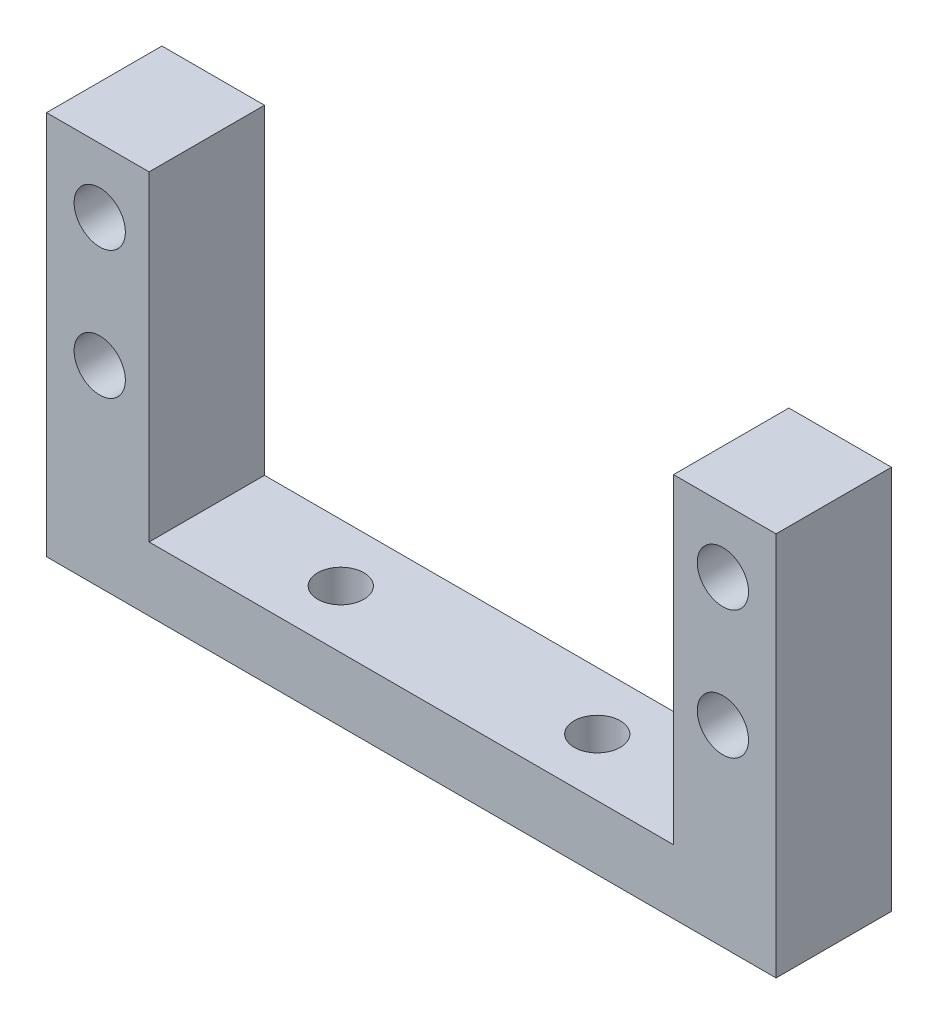
ISO-10303-21;
HEADER;
FILE_DESCRIPTION(('STEP AP214'),'2;1');
FILE_NAME('part.step','',(''),(''),'','','');
FILE_SCHEMA(('AUTOMOTIVE_DESIGN { 1 0 10303 214 1 1 1 1 }'));
ENDSEC;
DATA;
#1=APPLICATION_CONTEXT('core data for automotive mechanical design processes');
#2=APPLICATION_PROTOCOL_DEFINITION('international standard','automotive_design',2000,#1);
#3=PRODUCT_CONTEXT('',#1,'mechanical');
#4=PRODUCT('Part','Part','',(#3));
#5=PRODUCT_RELATED_PRODUCT_CATEGORY('part','',(#4));
#6=PRODUCT_DEFINITION_FORMATION('','',#4);
#7=PRODUCT_DEFINITION_CONTEXT('part definition',#1,'design');
#8=PRODUCT_DEFINITION('design','',#6,#7);
#9=PRODUCT_DEFINITION_SHAPE('','',#8);
#10=(LENGTH_UNIT() NAMED_UNIT(*) SI_UNIT(.MILLI.,.METRE.));
#11=(NAMED_UNIT(*) PLANE_ANGLE_UNIT() SI_UNIT($,.RADIAN.));
#12=(NAMED_UNIT(*) SI_UNIT($,.STERADIAN.) SOLID_ANGLE_UNIT());
#13=UNCERTAINTY_MEASURE_WITH_UNIT(LENGTH_MEASURE(1.E-05),#10,'distance_accuracy_value','');
#14=(GEOMETRIC_REPRESENTATION_CONTEXT(3) GLOBAL_UNCERTAINTY_ASSIGNED_CONTEXT((#13)) GLOBAL_UNIT_ASSIGNED_CONTEXT((#10,
#11,#12)) REPRESENTATION_CONTEXT('',''));
#15=CARTESIAN_POINT('',(0.,0.,0.));
#16=DIRECTION('',(0.,0.,1.));
#17=DIRECTION('',(1.,0.,0.));
#18=AXIS2_PLACEMENT_3D('',#15,#16,#17);
#19=CARTESIAN_POINT('',(0.,0.,9.));
#20=DIRECTION('',(0.,1.,0.));
#21=DIRECTION('',(-1.,0.,0.));
#22=AXIS2_PLACEMENT_3D('',#19,#20,#21);
#23=PLANE('',#22);
#24=CARTESIAN_POINT('',(18.45,0.,4.5));
#25=DIRECTION('',(0.,-1.,0.));
#26=DIRECTION('',(1.,0.,0.));
#27=AXIS2_PLACEMENT_3D('',#24,#25,#26);
#28=CIRCLE('',#27,1.8);
#29=CARTESIAN_POINT('',(20.25,0.,4.5));
#30=VERTEX_POINT('',#29);
#31=EDGE_CURVE('E197',#30,#30,#28,.T.);
#32=ORIENTED_EDGE('',*,*,#31,.F.);
#33=EDGE_LOOP('',(#32));
#34=FACE_BOUND('',#33,.T.);
#35=CARTESIAN_POINT('',(38.45,0.,4.5));
#36=DIRECTION('',(0.,-1.,0.));
#37=DIRECTION('',(1.,0.,0.));
#38=AXIS2_PLACEMENT_3D('',#35,#36,#37);
#39=CIRCLE('',#38,1.8);
#40=CARTESIAN_POINT('',(40.25,0.,4.5));
#41=VERTEX_POINT('',#40);
#42=EDGE_CURVE('E202',#41,#41,#39,.T.);
#43=ORIENTED_EDGE('',*,*,#42,.F.);
#44=EDGE_LOOP('',(#43));
#45=FACE_BOUND('',#44,.T.);
#46=DIRECTION('',(1.,0.,0.));
#47=VECTOR('',#46,1.);
#48=CARTESIAN_POINT('',(0.,0.,0.));
#49=LINE('',#48,#47);
#50=CARTESIAN_POINT('',(0.,0.,0.));
#51=VERTEX_POINT('',#50);
#52=CARTESIAN_POINT('',(56.9,0.,0.));
#53=VERTEX_POINT('',#52);
#54=EDGE_CURVE('E155',#51,#53,#49,.T.);
#55=ORIENTED_EDGE('',*,*,#54,.T.);
#56=DIRECTION('',(0.,0.,-1.));
#57=VECTOR('',#56,1.);
#58=CARTESIAN_POINT('',(56.9,0.,9.));
#59=LINE('',#58,#57);
#60=CARTESIAN_POINT('',(56.9,0.,9.));
#61=VERTEX_POINT('',#60);
#62=EDGE_CURVE('E11',#61,#53,#59,.T.);
#63=ORIENTED_EDGE('',*,*,#62,.F.);
#64=DIRECTION('',(1.,0.,0.));
#65=VECTOR('',#64,1.);
#66=CARTESIAN_POINT('',(0.,0.,9.));
#67=LINE('',#66,#65);
#68=CARTESIAN_POINT('',(0.,0.,9.));
#69=VERTEX_POINT('',#68);
#70=EDGE_CURVE('E187',#69,#61,#67,.T.);
#71=ORIENTED_EDGE('',*,*,#70,.F.);
#72=DIRECTION('',(0.,0.,-1.));
#73=VECTOR('',#72,1.);
#74=CARTESIAN_POINT('',(0.,0.,9.));
#75=LINE('',#74,#73);
#76=EDGE_CURVE('E61',#69,#51,#75,.T.);
#77=ORIENTED_EDGE('',*,*,#76,.T.);
#78=EDGE_LOOP('',(#55,#63,#71,#77));
#79=FACE_BOUND('',#78,.T.);
#80=ADVANCED_FACE('F43',(#34,#45,#79),#23,.F.);
#81=CARTESIAN_POINT('',(56.9,0.,9.));
#82=DIRECTION('',(-1.,0.,0.));
#83=DIRECTION('',(0.,-1.,0.));
#84=AXIS2_PLACEMENT_3D('',#81,#82,#83);
#85=PLANE('',#84);
#86=DIRECTION('',(0.,1.,0.));
#87=VECTOR('',#86,1.);
#88=CARTESIAN_POINT('',(56.9,0.,0.));
#89=LINE('',#88,#87);
#90=CARTESIAN_POINT('',(56.9,30.,0.));
#91=VERTEX_POINT('',#90);
#92=EDGE_CURVE('E157',#53,#91,#89,.T.);
#93=ORIENTED_EDGE('',*,*,#92,.T.);
#94=DIRECTION('',(0.,0.,-1.));
#95=VECTOR('',#94,1.);
#96=CARTESIAN_POINT('',(56.9,30.,9.));
#97=LINE('',#96,#95);
#98=CARTESIAN_POINT('',(56.9,30.,9.));
#99=VERTEX_POINT('',#98);
#100=EDGE_CURVE('E52',#99,#91,#97,.T.);
#101=ORIENTED_EDGE('',*,*,#100,.F.);
#102=DIRECTION('',(0.,1.,0.));
#103=VECTOR('',#102,1.);
#104=CARTESIAN_POINT('',(56.9,0.,9.));
#105=LINE('',#104,#103);
#106=EDGE_CURVE('E99',#61,#99,#105,.T.);
#107=ORIENTED_EDGE('',*,*,#106,.F.);
#108=ORIENTED_EDGE('',*,*,#62,.T.);
#109=EDGE_LOOP('',(#93,#101,#107,#108));
#110=FACE_BOUND('',#109,.T.);
#111=ADVANCED_FACE('F239',(#110),#85,.F.);
#112=CARTESIAN_POINT('',(0.,30.,9.));
#113=DIRECTION('',(0.,1.,0.));
#114=DIRECTION('',(-1.,0.,0.));
#115=AXIS2_PLACEMENT_3D('',#112,#113,#114);
#116=PLANE('',#115);
#117=DIRECTION('',(1.,0.,0.));
#118=VECTOR('',#117,1.);
#119=CARTESIAN_POINT('',(0.,30.,0.));
#120=LINE('',#119,#118);
#121=CARTESIAN_POINT('',(48.9,30.,0.));
#122=VERTEX_POINT('',#121);
#123=EDGE_CURVE('E160',#122,#91,#120,.T.);
#124=ORIENTED_EDGE('',*,*,#123,.F.);
#125=DIRECTION('',(0.,0.,-1.));
#126=VECTOR('',#125,1.);
#127=CARTESIAN_POINT('',(48.9,30.,9.));
#128=LINE('',#127,#126);
#129=CARTESIAN_POINT('',(48.9,30.,9.));
#130=VERTEX_POINT('',#129);
#131=EDGE_CURVE('E193',#130,#122,#128,.T.);
#132=ORIENTED_EDGE('',*,*,#131,.F.);
#133=DIRECTION('',(1.,0.,0.));
#134=VECTOR('',#133,1.);
#135=CARTESIAN_POINT('',(0.,30.,9.));
#136=LINE('',#135,#134);
#137=EDGE_CURVE('E211',#130,#99,#136,.T.);
#138=ORIENTED_EDGE('',*,*,#137,.T.);
#139=ORIENTED_EDGE('',*,*,#100,.T.);
#140=EDGE_LOOP('',(#124,#132,#138,#139));
#141=FACE_BOUND('',#140,.T.);
#142=ADVANCED_FACE('F244',(#141),#116,.T.);
#143=CARTESIAN_POINT('',(48.9,0.,9.));
#144=DIRECTION('',(-1.,0.,0.));
#145=DIRECTION('',(0.,-1.,0.));
#146=AXIS2_PLACEMENT_3D('',#143,#144,#145);
#147=PLANE('',#146);
#148=DIRECTION('',(0.,1.,0.));
#149=VECTOR('',#148,1.);
#150=CARTESIAN_POINT('',(48.9,0.,0.));
#151=LINE('',#150,#149);
#152=CARTESIAN_POINT('',(48.9,5.,0.));
#153=VERTEX_POINT('',#152);
#154=EDGE_CURVE('E163',#153,#122,#151,.T.);
#155=ORIENTED_EDGE('',*,*,#154,.F.);
#156=DIRECTION('',(0.,0.,-1.));
#157=VECTOR('',#156,1.);
#158=CARTESIAN_POINT('',(48.9,5.,9.));
#159=LINE('',#158,#157);
#160=CARTESIAN_POINT('',(48.9,5.,9.));
#161=VERTEX_POINT('',#160);
#162=EDGE_CURVE('E191',#161,#153,#159,.T.);
#163=ORIENTED_EDGE('',*,*,#162,.F.);
#164=DIRECTION('',(0.,1.,0.));
#165=VECTOR('',#164,1.);
#166=CARTESIAN_POINT('',(48.9,0.,9.));
#167=LINE('',#166,#165);
#168=EDGE_CURVE('E214',#161,#130,#167,.T.);
#169=ORIENTED_EDGE('',*,*,#168,.T.);
#170=ORIENTED_EDGE('',*,*,#131,.T.);
#171=EDGE_LOOP('',(#155,#163,#169,#170));
#172=FACE_BOUND('',#171,.T.);
#173=ADVANCED_FACE('F252',(#172),#147,.T.);
#174=CARTESIAN_POINT('',(0.,5.,9.));
#175=DIRECTION('',(0.,1.,0.));
#176=DIRECTION('',(0.,0.,1.));
#177=AXIS2_PLACEMENT_3D('',#174,#175,#176);
#178=PLANE('',#177);
#179=CARTESIAN_POINT('',(18.45,5.,4.5));
#180=DIRECTION('',(0.,1.,0.));
#181=DIRECTION('',(0.,0.,1.));
#182=AXIS2_PLACEMENT_3D('',#179,#180,#181);
#183=CIRCLE('',#182,1.8);
#184=CARTESIAN_POINT('',(18.45,5.,6.3));
#185=VERTEX_POINT('',#184);
#186=EDGE_CURVE('E46',#185,#185,#183,.T.);
#187=ORIENTED_EDGE('',*,*,#186,.F.);
#188=EDGE_LOOP('',(#187));
#189=FACE_BOUND('',#188,.T.);
#190=CARTESIAN_POINT('',(38.45,5.,4.5));
#191=DIRECTION('',(0.,1.,0.));
#192=DIRECTION('',(0.,0.,1.));
#193=AXIS2_PLACEMENT_3D('',#190,#191,#192);
#194=CIRCLE('',#193,1.8);
#195=CARTESIAN_POINT('',(38.45,5.,6.3));
#196=VERTEX_POINT('',#195);
#197=EDGE_CURVE('E195',#196,#196,#194,.T.);
#198=ORIENTED_EDGE('',*,*,#197,.F.);
#199=EDGE_LOOP('',(#198));
#200=FACE_BOUND('',#199,.T.);
#201=DIRECTION('',(1.,0.,0.));
#202=VECTOR('',#201,1.);
#203=CARTESIAN_POINT('',(0.,5.,0.));
#204=LINE('',#203,#202);
#205=CARTESIAN_POINT('',(8.,5.,0.));
#206=VERTEX_POINT('',#205);
#207=EDGE_CURVE('E166',#206,#153,#204,.T.);
#208=ORIENTED_EDGE('',*,*,#207,.F.);
#209=DIRECTION('',(0.,0.,-1.));
#210=VECTOR('',#209,1.);
#211=CARTESIAN_POINT('',(8.,5.,9.));
#212=LINE('',#211,#210);
#213=CARTESIAN_POINT('',(8.,5.,9.));
#214=VERTEX_POINT('',#213);
#215=EDGE_CURVE('E135',#214,#206,#212,.T.);
#216=ORIENTED_EDGE('',*,*,#215,.F.);
#217=DIRECTION('',(1.,0.,0.));
#218=VECTOR('',#217,1.);
#219=CARTESIAN_POINT('',(0.,5.,9.));
#220=LINE('',#219,#218);
#221=EDGE_CURVE('E125',#214,#161,#220,.T.);
#222=ORIENTED_EDGE('',*,*,#221,.T.);
#223=ORIENTED_EDGE('',*,*,#162,.T.);
#224=EDGE_LOOP('',(#208,#216,#222,#223));
#225=FACE_BOUND('',#224,.T.);
#226=ADVANCED_FACE('F218',(#189,#200,#225),#178,.T.);
#227=CARTESIAN_POINT('',(8.,0.,9.));
#228=DIRECTION('',(-1.,0.,0.));
#229=DIRECTION('',(0.,0.,1.));
#230=AXIS2_PLACEMENT_3D('',#227,#228,#229);
#231=PLANE('',#230);
#232=DIRECTION('',(0.,1.,0.));
#233=VECTOR('',#232,1.);
#234=CARTESIAN_POINT('',(8.,0.,0.));
#235=LINE('',#234,#233);
#236=CARTESIAN_POINT('',(8.,30.,0.));
#237=VERTEX_POINT('',#236);
#238=EDGE_CURVE('E132',#206,#237,#235,.T.);
#239=ORIENTED_EDGE('',*,*,#238,.T.);
#240=DIRECTION('',(0.,0.,-1.));
#241=VECTOR('',#240,1.);
#242=CARTESIAN_POINT('',(8.,30.,9.));
#243=LINE('',#242,#241);
#244=CARTESIAN_POINT('',(8.,30.,9.));
#245=VERTEX_POINT('',#244);
#246=EDGE_CURVE('E129',#245,#237,#243,.T.);
#247=ORIENTED_EDGE('',*,*,#246,.F.);
#248=DIRECTION('',(0.,1.,0.));
#249=VECTOR('',#248,1.);
#250=CARTESIAN_POINT('',(8.,0.,9.));
#251=LINE('',#250,#249);
#252=EDGE_CURVE('E116',#214,#245,#251,.T.);
#253=ORIENTED_EDGE('',*,*,#252,.F.);
#254=ORIENTED_EDGE('',*,*,#215,.T.);
#255=EDGE_LOOP('',(#239,#247,#253,#254));
#256=FACE_BOUND('',#255,.T.);
#257=ADVANCED_FACE('F130',(#256),#231,.F.);
#258=CARTESIAN_POINT('',(0.,30.,9.));
#259=DIRECTION('',(0.,1.,0.));
#260=DIRECTION('',(0.,0.,1.));
#261=AXIS2_PLACEMENT_3D('',#258,#259,#260);
#262=PLANE('',#261);
#263=DIRECTION('',(1.,0.,0.));
#264=VECTOR('',#263,1.);
#265=CARTESIAN_POINT('',(0.,30.,0.));
#266=LINE('',#265,#264);
#267=CARTESIAN_POINT('',(0.,30.,0.));
#268=VERTEX_POINT('',#267);
#269=EDGE_CURVE('E170',#268,#237,#266,.T.);
#270=ORIENTED_EDGE('',*,*,#269,.F.);
#271=DIRECTION('',(0.,0.,-1.));
#272=VECTOR('',#271,1.);
#273=CARTESIAN_POINT('',(0.,30.,9.));
#274=LINE('',#273,#272);
#275=CARTESIAN_POINT('',(0.,30.,9.));
#276=VERTEX_POINT('',#275);
#277=EDGE_CURVE('E87',#276,#268,#274,.T.);
#278=ORIENTED_EDGE('',*,*,#277,.F.);
#279=DIRECTION('',(1.,0.,0.));
#280=VECTOR('',#279,1.);
#281=CARTESIAN_POINT('',(0.,30.,9.));
#282=LINE('',#281,#280);
#283=EDGE_CURVE('E122',#276,#245,#282,.T.);
#284=ORIENTED_EDGE('',*,*,#283,.T.);
#285=ORIENTED_EDGE('',*,*,#246,.T.);
#286=EDGE_LOOP('',(#270,#278,#284,#285));
#287=FACE_BOUND('',#286,.T.);
#288=ADVANCED_FACE('F137',(#287),#262,.T.);
#289=CARTESIAN_POINT('',(52.75,15.,9.));
#290=DIRECTION('',(0.,0.,-1.));
#291=DIRECTION('',(-1.,0.,0.));
#292=AXIS2_PLACEMENT_3D('',#289,#290,#291);
#293=CYLINDRICAL_SURFACE('',#292,2.);
#294=CARTESIAN_POINT('',(52.75,15.,9.));
#295=DIRECTION('',(0.,0.,1.));
#296=DIRECTION('',(1.,0.,0.));
#297=AXIS2_PLACEMENT_3D('',#294,#295,#296);
#298=CIRCLE('',#297,2.);
#299=CARTESIAN_POINT('',(54.75,15.,9.));
#300=VERTEX_POINT('',#299);
#301=EDGE_CURVE('E149',#300,#300,#298,.T.);
#302=ORIENTED_EDGE('',*,*,#301,.T.);
#303=EDGE_LOOP('',(#302));
#304=FACE_BOUND('',#303,.T.);
#305=CARTESIAN_POINT('',(52.75,15.,0.));
#306=DIRECTION('',(0.,0.,1.));
#307=DIRECTION('',(1.,0.,0.));
#308=AXIS2_PLACEMENT_3D('',#305,#306,#307);
#309=CIRCLE('',#308,2.);
#310=CARTESIAN_POINT('',(54.75,15.,0.));
#311=VERTEX_POINT('',#310);
#312=EDGE_CURVE('E181',#311,#311,#309,.T.);
#313=ORIENTED_EDGE('',*,*,#312,.F.);
#314=EDGE_LOOP('',(#313));
#315=FACE_BOUND('',#314,.T.);
#316=ADVANCED_FACE('F265',(#304,#315),#293,.F.);
#317=CARTESIAN_POINT('',(4.15,25.,9.));
#318=DIRECTION('',(0.,0.,-1.));
#319=DIRECTION('',(-1.,0.,0.));
#320=AXIS2_PLACEMENT_3D('',#317,#318,#319);
#321=CYLINDRICAL_SURFACE('',#320,2.);
#322=CARTESIAN_POINT('',(4.15,25.,9.));
#323=DIRECTION('',(0.,0.,1.));
#324=DIRECTION('',(1.,0.,0.));
#325=AXIS2_PLACEMENT_3D('',#322,#323,#324);
#326=CIRCLE('',#325,2.);
#327=CARTESIAN_POINT('',(6.15,25.,9.));
#328=VERTEX_POINT('',#327);
#329=EDGE_CURVE('E146',#328,#328,#326,.T.);
#330=ORIENTED_EDGE('',*,*,#329,.T.);
#331=EDGE_LOOP('',(#330));
#332=FACE_BOUND('',#331,.T.);
#333=CARTESIAN_POINT('',(4.15,25.,0.));
#334=DIRECTION('',(0.,0.,1.));
#335=DIRECTION('',(1.,0.,0.));
#336=AXIS2_PLACEMENT_3D('',#333,#334,#335);
#337=CIRCLE('',#336,2.);
#338=CARTESIAN_POINT('',(6.15,25.,0.));
#339=VERTEX_POINT('',#338);
#340=EDGE_CURVE('E178',#339,#339,#337,.T.);
#341=ORIENTED_EDGE('',*,*,#340,.F.);
#342=EDGE_LOOP('',(#341));
#343=FACE_BOUND('',#342,.T.);
#344=ADVANCED_FACE('F234',(#332,#343),#321,.F.);
#345=CARTESIAN_POINT('',(4.15,15.,9.));
#346=DIRECTION('',(0.,0.,-1.));
#347=DIRECTION('',(-1.,0.,0.));
#348=AXIS2_PLACEMENT_3D('',#345,#346,#347);
#349=CYLINDRICAL_SURFACE('',#348,2.);
#350=CARTESIAN_POINT('',(4.15,15.,9.));
#351=DIRECTION('',(0.,0.,1.));
#352=DIRECTION('',(1.,0.,0.));
#353=AXIS2_PLACEMENT_3D('',#350,#351,#352);
#354=CIRCLE('',#353,2.);
#355=CARTESIAN_POINT('',(6.15,15.,9.));
#356=VERTEX_POINT('',#355);
#357=EDGE_CURVE('E140',#356,#356,#354,.T.);
#358=ORIENTED_EDGE('',*,*,#357,.T.);
#359=EDGE_LOOP('',(#358));
#360=FACE_BOUND('',#359,.T.);
#361=CARTESIAN_POINT('',(4.15,15.,0.));
#362=DIRECTION('',(0.,0.,1.));
#363=DIRECTION('',(1.,0.,0.));
#364=AXIS2_PLACEMENT_3D('',#361,#362,#363);
#365=CIRCLE('',#364,2.);
#366=CARTESIAN_POINT('',(6.15,15.,0.));
#367=VERTEX_POINT('',#366);
#368=EDGE_CURVE('E175',#367,#367,#365,.T.);
#369=ORIENTED_EDGE('',*,*,#368,.F.);
#370=EDGE_LOOP('',(#369));
#371=FACE_BOUND('',#370,.T.);
#372=ADVANCED_FACE('F226',(#360,#371),#349,.F.);
#373=CARTESIAN_POINT('',(0.,0.,9.));
#374=DIRECTION('',(-1.,0.,0.));
#375=DIRECTION('',(0.,0.,1.));
#376=AXIS2_PLACEMENT_3D('',#373,#374,#375);
#377=PLANE('',#376);
#378=DIRECTION('',(0.,1.,0.));
#379=VECTOR('',#378,1.);
#380=CARTESIAN_POINT('',(0.,0.,0.));
#381=LINE('',#380,#379);
#382=EDGE_CURVE('E172',#51,#268,#381,.T.);
#383=ORIENTED_EDGE('',*,*,#382,.F.);
#384=ORIENTED_EDGE('',*,*,#76,.F.);
#385=DIRECTION('',(0.,1.,0.));
#386=VECTOR('',#385,1.);
#387=CARTESIAN_POINT('',(0.,0.,9.));
#388=LINE('',#387,#386);
#389=EDGE_CURVE('E138',#69,#276,#388,.T.);
#390=ORIENTED_EDGE('',*,*,#389,.T.);
#391=ORIENTED_EDGE('',*,*,#277,.T.);
#392=EDGE_LOOP('',(#383,#384,#390,#391));
#393=FACE_BOUND('',#392,.T.);
#394=ADVANCED_FACE('F223',(#393),#377,.T.);
#395=CARTESIAN_POINT('',(52.75,25.,9.));
#396=DIRECTION('',(0.,0.,-1.));
#397=DIRECTION('',(-1.,0.,0.));
#398=AXIS2_PLACEMENT_3D('',#395,#396,#397);
#399=CYLINDRICAL_SURFACE('',#398,2.);
#400=CARTESIAN_POINT('',(52.75,25.,9.));
#401=DIRECTION('',(0.,0.,1.));
#402=DIRECTION('',(1.,0.,0.));
#403=AXIS2_PLACEMENT_3D('',#400,#401,#402);
#404=CIRCLE('',#403,2.);
#405=CARTESIAN_POINT('',(54.75,25.,9.));
#406=VERTEX_POINT('',#405);
#407=EDGE_CURVE('E152',#406,#406,#404,.T.);
#408=ORIENTED_EDGE('',*,*,#407,.T.);
#409=EDGE_LOOP('',(#408));
#410=FACE_BOUND('',#409,.T.);
#411=CARTESIAN_POINT('',(52.75,25.,0.));
#412=DIRECTION('',(0.,0.,1.));
#413=DIRECTION('',(1.,0.,0.));
#414=AXIS2_PLACEMENT_3D('',#411,#412,#413);
#415=CIRCLE('',#414,2.);
#416=CARTESIAN_POINT('',(54.75,25.,0.));
#417=VERTEX_POINT('',#416);
#418=EDGE_CURVE('E184',#417,#417,#415,.T.);
#419=ORIENTED_EDGE('',*,*,#418,.F.);
#420=EDGE_LOOP('',(#419));
#421=FACE_BOUND('',#420,.T.);
#422=ADVANCED_FACE('F225',(#410,#421),#399,.F.);
#423=CARTESIAN_POINT('',(0.,0.,9.));
#424=DIRECTION('',(0.,0.,1.));
#425=DIRECTION('',(1.,0.,0.));
#426=AXIS2_PLACEMENT_3D('',#423,#424,#425);
#427=PLANE('',#426);
#428=ORIENTED_EDGE('',*,*,#70,.T.);
#429=ORIENTED_EDGE('',*,*,#106,.T.);
#430=ORIENTED_EDGE('',*,*,#137,.F.);
#431=ORIENTED_EDGE('',*,*,#168,.F.);
#432=ORIENTED_EDGE('',*,*,#221,.F.);
#433=ORIENTED_EDGE('',*,*,#252,.T.);
#434=ORIENTED_EDGE('',*,*,#283,.F.);
#435=ORIENTED_EDGE('',*,*,#389,.F.);
#436=EDGE_LOOP('',(#428,#429,#430,#431,#432,#433,#434,#435));
#437=FACE_BOUND('',#436,.T.);
#438=ORIENTED_EDGE('',*,*,#357,.F.);
#439=EDGE_LOOP('',(#438));
#440=FACE_BOUND('',#439,.T.);
#441=ORIENTED_EDGE('',*,*,#329,.F.);
#442=EDGE_LOOP('',(#441));
#443=FACE_BOUND('',#442,.T.);
#444=ORIENTED_EDGE('',*,*,#301,.F.);
#445=EDGE_LOOP('',(#444));
#446=FACE_BOUND('',#445,.T.);
#447=ORIENTED_EDGE('',*,*,#407,.F.);
#448=EDGE_LOOP('',(#447));
#449=FACE_BOUND('',#448,.T.);
#450=ADVANCED_FACE('F118',(#437,#440,#443,#446,#449),#427,.T.);
#451=CARTESIAN_POINT('',(0.,0.,0.));
#452=DIRECTION('',(0.,0.,1.));
#453=DIRECTION('',(1.,0.,0.));
#454=AXIS2_PLACEMENT_3D('',#451,#452,#453);
#455=PLANE('',#454);
#456=ORIENTED_EDGE('',*,*,#54,.F.);
#457=ORIENTED_EDGE('',*,*,#382,.T.);
#458=ORIENTED_EDGE('',*,*,#269,.T.);
#459=ORIENTED_EDGE('',*,*,#238,.F.);
#460=ORIENTED_EDGE('',*,*,#207,.T.);
#461=ORIENTED_EDGE('',*,*,#154,.T.);
#462=ORIENTED_EDGE('',*,*,#123,.T.);
#463=ORIENTED_EDGE('',*,*,#92,.F.);
#464=EDGE_LOOP('',(#456,#457,#458,#459,#460,#461,#462,#463));
#465=FACE_BOUND('',#464,.T.);
#466=ORIENTED_EDGE('',*,*,#368,.T.);
#467=EDGE_LOOP('',(#466));
#468=FACE_BOUND('',#467,.T.);
#469=ORIENTED_EDGE('',*,*,#340,.T.);
#470=EDGE_LOOP('',(#469));
#471=FACE_BOUND('',#470,.T.);
#472=ORIENTED_EDGE('',*,*,#312,.T.);
#473=EDGE_LOOP('',(#472));
#474=FACE_BOUND('',#473,.T.);
#475=ORIENTED_EDGE('',*,*,#418,.T.);
#476=EDGE_LOOP('',(#475));
#477=FACE_BOUND('',#476,.T.);
#478=ADVANCED_FACE('F221',(#465,#468,#471,#474,#477),#455,.F.);
#479=CARTESIAN_POINT('',(38.45,9.,4.5));
#480=DIRECTION('',(0.,-1.,0.));
#481=DIRECTION('',(1.,0.,0.));
#482=AXIS2_PLACEMENT_3D('',#479,#480,#481);
#483=CYLINDRICAL_SURFACE('',#482,1.8);
#484=ORIENTED_EDGE('',*,*,#197,.T.);
#485=EDGE_LOOP('',(#484));
#486=FACE_BOUND('',#485,.T.);
#487=ORIENTED_EDGE('',*,*,#42,.T.);
#488=EDGE_LOOP('',(#487));
#489=FACE_BOUND('',#488,.T.);
#490=ADVANCED_FACE('F280',(#486,#489),#483,.F.);
#491=CARTESIAN_POINT('',(18.45,9.,4.5));
#492=DIRECTION('',(0.,-1.,0.));
#493=DIRECTION('',(1.,0.,0.));
#494=AXIS2_PLACEMENT_3D('',#491,#492,#493);
#495=CYLINDRICAL_SURFACE('',#494,1.8);
#496=ORIENTED_EDGE('',*,*,#186,.T.);
#497=EDGE_LOOP('',(#496));
#498=FACE_BOUND('',#497,.T.);
#499=ORIENTED_EDGE('',*,*,#31,.T.);
#500=EDGE_LOOP('',(#499));
#501=FACE_BOUND('',#500,.T.);
#502=ADVANCED_FACE('F285',(#498,#501),#495,.F.);
#503=CLOSED_SHELL('',(#80,#111,#142,#173,#226,#257,#288,#316,#344,#372,#394,#422,#450,#478,#490,#502));
#504=MANIFOLD_SOLID_BREP('B2',#503);
#505=ADVANCED_BREP_SHAPE_REPRESENTATION('',(#18,#504),#14);
#506=SHAPE_DEFINITION_REPRESENTATION(#9,#505);
ENDSEC;
END-ISO-10303-21;
